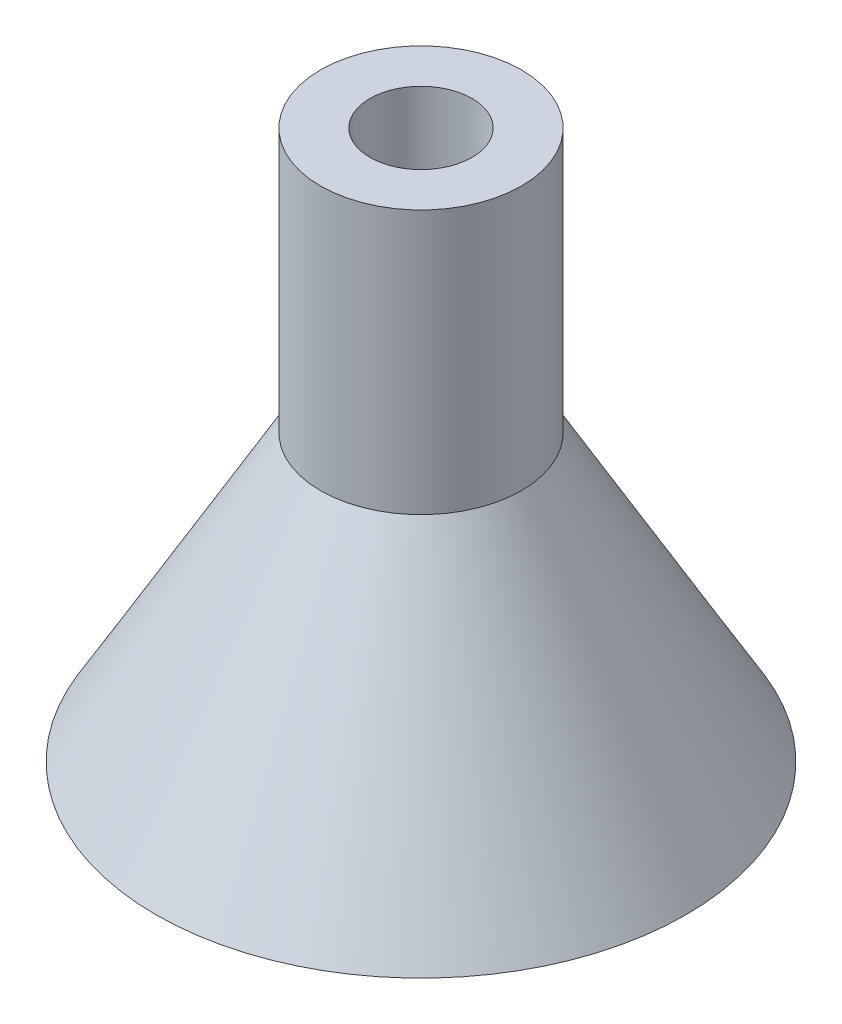
ISO-10303-21;
HEADER;
FILE_DESCRIPTION(('STEP AP214'),'2;1');
FILE_NAME('part.step','',(''),(''),'','','');
FILE_SCHEMA(('AUTOMOTIVE_DESIGN { 1 0 10303 214 1 1 1 1 }'));
ENDSEC;
DATA;
#1=APPLICATION_CONTEXT('core data for automotive mechanical design processes');
#2=APPLICATION_PROTOCOL_DEFINITION('international standard','automotive_design',2000,#1);
#3=PRODUCT_CONTEXT('',#1,'mechanical');
#4=PRODUCT('Part','Part','',(#3));
#5=PRODUCT_RELATED_PRODUCT_CATEGORY('part','',(#4));
#6=PRODUCT_DEFINITION_FORMATION('','',#4);
#7=PRODUCT_DEFINITION_CONTEXT('part definition',#1,'design');
#8=PRODUCT_DEFINITION('design','',#6,#7);
#9=PRODUCT_DEFINITION_SHAPE('','',#8);
#10=(LENGTH_UNIT() NAMED_UNIT(*) SI_UNIT(.MILLI.,.METRE.));
#11=(NAMED_UNIT(*) PLANE_ANGLE_UNIT() SI_UNIT($,.RADIAN.));
#12=(NAMED_UNIT(*) SI_UNIT($,.STERADIAN.) SOLID_ANGLE_UNIT());
#13=UNCERTAINTY_MEASURE_WITH_UNIT(LENGTH_MEASURE(1.E-05),#10,'distance_accuracy_value','');
#14=(GEOMETRIC_REPRESENTATION_CONTEXT(3) GLOBAL_UNCERTAINTY_ASSIGNED_CONTEXT((#13)) GLOBAL_UNIT_ASSIGNED_CONTEXT((#10,
#11,#12)) REPRESENTATION_CONTEXT('',''));
#15=CARTESIAN_POINT('',(0.,0.,0.));
#16=DIRECTION('',(0.,0.,1.));
#17=DIRECTION('',(1.,0.,0.));
#18=AXIS2_PLACEMENT_3D('',#15,#16,#17);
#19=CARTESIAN_POINT('',(0.,0.,0.));
#20=DIRECTION('',(0.,-1.,0.));
#21=DIRECTION('',(0.,0.,-1.));
#22=AXIS2_PLACEMENT_3D('',#19,#20,#21);
#23=CONICAL_SURFACE('',#22,16.0745216452511,0.523598775598293);
#24=CARTESIAN_POINT('',(0.,17.283306474001,0.));
#25=DIRECTION('',(0.,-1.,0.));
#26=DIRECTION('',(0.,0.,-1.));
#27=AXIS2_PLACEMENT_3D('',#24,#25,#26);
#28=CIRCLE('',#27,6.096);
#29=CARTESIAN_POINT('',(0.,17.283306474001,-6.096));
#30=VERTEX_POINT('',#29);
#31=EDGE_CURVE('E10',#30,#30,#28,.T.);
#32=ORIENTED_EDGE('',*,*,#31,.T.);
#33=EDGE_LOOP('',(#32));
#34=FACE_BOUND('',#33,.T.);
#35=CARTESIAN_POINT('',(0.,0.,0.));
#36=DIRECTION('',(0.,-1.,0.));
#37=DIRECTION('',(0.,0.,-1.));
#38=AXIS2_PLACEMENT_3D('',#35,#36,#37);
#39=CIRCLE('',#38,16.0745216452511);
#40=CARTESIAN_POINT('',(0.,0.,-16.0745216452511));
#41=VERTEX_POINT('',#40);
#42=EDGE_CURVE('E53',#41,#41,#39,.T.);
#43=ORIENTED_EDGE('',*,*,#42,.F.);
#44=EDGE_LOOP('',(#43));
#45=FACE_BOUND('',#44,.T.);
#46=ADVANCED_FACE('F31',(#34,#45),#23,.T.);
#47=CARTESIAN_POINT('',(0.,0.,0.));
#48=DIRECTION('',(0.,-1.,0.));
#49=DIRECTION('',(0.,0.,-1.));
#50=AXIS2_PLACEMENT_3D('',#47,#48,#49);
#51=CYLINDRICAL_SURFACE('',#50,6.096);
#52=CARTESIAN_POINT('',(0.,33.283306474001,0.));
#53=DIRECTION('',(0.,-1.,0.));
#54=DIRECTION('',(0.,0.,-1.));
#55=AXIS2_PLACEMENT_3D('',#52,#53,#54);
#56=CIRCLE('',#55,6.096);
#57=CARTESIAN_POINT('',(0.,33.283306474001,-6.096));
#58=VERTEX_POINT('',#57);
#59=EDGE_CURVE('E37',#58,#58,#56,.T.);
#60=ORIENTED_EDGE('',*,*,#59,.T.);
#61=EDGE_LOOP('',(#60));
#62=FACE_BOUND('',#61,.T.);
#63=ORIENTED_EDGE('',*,*,#31,.F.);
#64=EDGE_LOOP('',(#63));
#65=FACE_BOUND('',#64,.T.);
#66=ADVANCED_FACE('F61',(#62,#65),#51,.T.);
#67=CARTESIAN_POINT('',(6.096,33.283306474001,0.));
#68=DIRECTION('',(0.,1.,0.));
#69=DIRECTION('',(0.,0.,1.));
#70=AXIS2_PLACEMENT_3D('',#67,#68,#69);
#71=PLANE('',#70);
#72=CARTESIAN_POINT('',(0.,33.283306474001,0.));
#73=DIRECTION('',(0.,-1.,0.));
#74=DIRECTION('',(0.,0.,-1.));
#75=AXIS2_PLACEMENT_3D('',#72,#73,#74);
#76=CIRCLE('',#75,3.096);
#77=CARTESIAN_POINT('',(0.,33.283306474001,-3.096));
#78=VERTEX_POINT('',#77);
#79=EDGE_CURVE('E41',#78,#78,#76,.T.);
#80=ORIENTED_EDGE('',*,*,#79,.T.);
#81=EDGE_LOOP('',(#80));
#82=FACE_BOUND('',#81,.T.);
#83=ORIENTED_EDGE('',*,*,#59,.F.);
#84=EDGE_LOOP('',(#83));
#85=FACE_BOUND('',#84,.T.);
#86=ADVANCED_FACE('F65',(#82,#85),#71,.T.);
#87=CARTESIAN_POINT('',(0.,0.,0.));
#88=DIRECTION('',(0.,-1.,0.));
#89=DIRECTION('',(0.,0.,-1.));
#90=AXIS2_PLACEMENT_3D('',#87,#88,#89);
#91=CYLINDRICAL_SURFACE('',#90,3.096);
#92=CARTESIAN_POINT('',(0.,17.2794588967076,0.));
#93=DIRECTION('',(0.,-1.,0.));
#94=DIRECTION('',(0.,0.,-1.));
#95=AXIS2_PLACEMENT_3D('',#92,#93,#94);
#96=CIRCLE('',#95,3.096);
#97=CARTESIAN_POINT('',(0.,17.2794588967076,-3.096));
#98=VERTEX_POINT('',#97);
#99=EDGE_CURVE('E45',#98,#98,#96,.T.);
#100=ORIENTED_EDGE('',*,*,#99,.T.);
#101=EDGE_LOOP('',(#100));
#102=FACE_BOUND('',#101,.T.);
#103=ORIENTED_EDGE('',*,*,#79,.F.);
#104=EDGE_LOOP('',(#103));
#105=FACE_BOUND('',#104,.T.);
#106=ADVANCED_FACE('F69',(#102,#105),#91,.F.);
#107=CARTESIAN_POINT('',(0.,17.2794588967076,0.));
#108=DIRECTION('',(0.,-1.,0.));
#109=DIRECTION('',(0.,0.,-1.));
#110=AXIS2_PLACEMENT_3D('',#107,#108,#109);
#111=CONICAL_SURFACE('',#110,3.096,0.523598775598293);
#112=CARTESIAN_POINT('',(0.,0.,0.));
#113=DIRECTION('',(0.,-1.,0.));
#114=DIRECTION('',(0.,0.,-1.));
#115=AXIS2_PLACEMENT_3D('',#112,#113,#114);
#116=CIRCLE('',#115,13.0723002454651);
#117=CARTESIAN_POINT('',(0.,0.,-13.0723002454651));
#118=VERTEX_POINT('',#117);
#119=EDGE_CURVE('E50',#118,#118,#116,.T.);
#120=CARTESIAN_POINT('',(0.,0.,-13.0723002454651));
#121=CARTESIAN_POINT('',(0.,0.179994363507372,-12.9683804512415));
#122=CARTESIAN_POINT('',(0.,0.359988727014744,-12.8644606570179));
#123=CARTESIAN_POINT('',(0.,0.719977454029485,-12.6566210685707));
#124=CARTESIAN_POINT('',(0.,0.899971817536856,-12.5527012743471));
#125=CARTESIAN_POINT('',(0.,1.2599605445516,-12.3448616858999));
#126=CARTESIAN_POINT('',(0.,1.43995490805897,-12.2409418916763));
#127=CARTESIAN_POINT('',(0.,1.79994363507371,-12.0331023032291));
#128=CARTESIAN_POINT('',(0.,1.97993799858108,-11.9291825090055));
#129=CARTESIAN_POINT('',(0.,2.33992672559582,-11.7213429205584));
#130=CARTESIAN_POINT('',(0.,2.5199210891032,-11.6174231263348));
#131=CARTESIAN_POINT('',(0.,2.87990981611794,-11.4095835378876));
#132=CARTESIAN_POINT('',(0.,3.05990417962531,-11.305663743664));
#133=CARTESIAN_POINT('',(0.,3.41989290664005,-11.0978241552168));
#134=CARTESIAN_POINT('',(0.,3.59988727014742,-10.9939043609932));
#135=CARTESIAN_POINT('',(0.,3.95987599716217,-10.786064772546));
#136=CARTESIAN_POINT('',(0.,4.13987036066954,-10.6821449783224));
#137=CARTESIAN_POINT('',(0.,4.49985908768428,-10.4743053898752));
#138=CARTESIAN_POINT('',(0.,4.67985345119165,-10.3703855956516));
#139=CARTESIAN_POINT('',(0.,5.03984217820639,-10.1625460072044));
#140=CARTESIAN_POINT('',(0.,5.21983654171376,-10.0586262129808));
#141=CARTESIAN_POINT('',(0.,5.5798252687285,-9.85078662453366));
#142=CARTESIAN_POINT('',(0.,5.75981963223588,-9.74686683031006));
#143=CARTESIAN_POINT('',(0.,6.11980835925062,-9.53902724186287));
#144=CARTESIAN_POINT('',(0.,6.29980272275799,-9.43510744763928));
#145=CARTESIAN_POINT('',(0.,6.65979144977273,-9.22726785919209));
#146=CARTESIAN_POINT('',(0.,6.8397858132801,-9.12334806496849));
#147=CARTESIAN_POINT('',(0.,7.19977454029484,-8.9155084765213));
#148=CARTESIAN_POINT('',(0.,7.37976890380222,-8.81158868229771));
#149=CARTESIAN_POINT('',(0.,7.73975763081696,-8.60374909385052));
#150=CARTESIAN_POINT('',(0.,7.91975199432433,-8.49982929962692));
#151=CARTESIAN_POINT('',(0.,8.27974072133907,-8.29198971117973));
#152=CARTESIAN_POINT('',(0.,8.45973508484644,-8.18806991695614));
#153=CARTESIAN_POINT('',(0.,8.81972381186119,-7.98023032850895));
#154=CARTESIAN_POINT('',(0.,8.99971817536856,-7.87631053428535));
#155=CARTESIAN_POINT('',(0.,9.3597069023833,-7.66847094583817));
#156=CARTESIAN_POINT('',(0.,9.53970126589067,-7.56455115161457));
#157=CARTESIAN_POINT('',(0.,9.89968999290541,-7.35671156316738));
#158=CARTESIAN_POINT('',(0.,10.0796843564128,-7.25279176894379));
#159=CARTESIAN_POINT('',(0.,10.4396730834275,-7.0449521804966));
#160=CARTESIAN_POINT('',(0.,10.6196674469349,-6.94103238627301));
#161=CARTESIAN_POINT('',(0.,10.9796561739496,-6.73319279782582));
#162=CARTESIAN_POINT('',(0.,11.159650537457,-6.62927300360222));
#163=CARTESIAN_POINT('',(0.,11.5196392644718,-6.42143341515503));
#164=CARTESIAN_POINT('',(0.,11.6996336279791,-6.31751362093144));
#165=CARTESIAN_POINT('',(0.,12.0596223549939,-6.10967403248425));
#166=CARTESIAN_POINT('',(0.,12.2396167185012,-6.00575423826065));
#167=CARTESIAN_POINT('',(0.,12.599605445516,-5.79791464981346));
#168=CARTESIAN_POINT('',(0.,12.7795998090234,-5.69399485558987));
#169=CARTESIAN_POINT('',(0.,13.1395885360381,-5.48615526714268));
#170=CARTESIAN_POINT('',(0.,13.3195828995455,-5.38223547291908));
#171=CARTESIAN_POINT('',(0.,13.6795716265602,-5.1743958844719));
#172=CARTESIAN_POINT('',(0.,13.8595659900676,-5.0704760902483));
#173=CARTESIAN_POINT('',(0.,14.2195547170823,-4.86263650180111));
#174=CARTESIAN_POINT('',(0.,14.3995490805897,-4.75871670757752));
#175=CARTESIAN_POINT('',(0.,14.7595378076044,-4.55087711913033));
#176=CARTESIAN_POINT('',(0.,14.9395321711118,-4.44695732490673));
#177=CARTESIAN_POINT('',(0.,15.2995208981265,-4.23911773645954));
#178=CARTESIAN_POINT('',(0.,15.4795152616339,-4.13519794223595));
#179=CARTESIAN_POINT('',(0.,15.8395039886487,-3.92735835378876));
#180=CARTESIAN_POINT('',(0.,16.019498352156,-3.82343855956516));
#181=CARTESIAN_POINT('',(0.,16.3794870791708,-3.61559897111798));
#182=CARTESIAN_POINT('',(0.,16.5594814426781,-3.51167917689438));
#183=CARTESIAN_POINT('',(0.,16.9194701696929,-3.30383958844719));
#184=CARTESIAN_POINT('',(0.,17.0994645332003,-3.1999197942236));
#185=CARTESIAN_POINT('',(0.,17.2794588967076,-3.096));
#186=B_SPLINE_CURVE_WITH_KNOTS('',3,(#120,#121,#122,#123,#124,#125,#126,#127,#128,#129,#130,
#131,#132,#133,#134,#135,#136,#137,#138,#139,#140,#141,#142,#143,#144,#145,#146,#147,#148,#149,
#150,#151,#152,#153,#154,#155,#156,#157,#158,#159,#160,#161,#162,#163,#164,#165,#166,#167,#168,
#169,#170,#171,#172,#173,#174,#175,#176,#177,#178,#179,#180,#181,#182,#183,#184,#185),
.UNSPECIFIED.,.F.,.F.,(4,2,2,2,2,2,2,2,2,2,2,2,2,2,2,2,2,2,2,2,2,2,2,2,2,2,2,2,2,2,2,2,4),(0.,
0.623518765341576,1.24703753068315,1.87055629602472,2.4940750613663,3.11759382670787,
3.74111259204945,4.36463135739102,4.98815012273259,5.61166888807417,6.23518765341574,
6.85870641875732,7.48222518409889,8.10574394944046,8.72926271478204,9.35278148012362,
9.97630024546519,10.5998190108068,11.2233377761483,11.8468565414899,12.4703753068315,
13.0938940721731,13.7174128375146,14.3409316028562,14.9644503681978,15.5879691335394,
16.2114878988809,16.8350066642225,17.4585254295641,18.0820441949057,18.7055629602472,
19.3290817255888,19.9526004909304),.UNSPECIFIED.);
#187=EDGE_CURVE('BSEAM76',#118,#98,#186,.T.);
#188=ORIENTED_EDGE('',*,*,#119,.T.);
#189=ORIENTED_EDGE('',*,*,#99,.F.);
#190=ORIENTED_EDGE('',*,*,#187,.T.);
#191=ORIENTED_EDGE('',*,*,#187,.F.);
#192=EDGE_LOOP('',(#188,#190,#189,#191));
#193=FACE_BOUND('',#192,.T.);
#194=ADVANCED_FACE('F76',(#193),#111,.F.);
#195=CARTESIAN_POINT('',(13.0723002454651,0.,0.));
#196=DIRECTION('',(0.,-1.,0.));
#197=DIRECTION('',(0.,0.,-1.));
#198=AXIS2_PLACEMENT_3D('',#195,#196,#197);
#199=PLANE('',#198);
#200=ORIENTED_EDGE('',*,*,#42,.T.);
#201=EDGE_LOOP('',(#200));
#202=FACE_BOUND('',#201,.T.);
#203=ORIENTED_EDGE('',*,*,#119,.F.);
#204=EDGE_LOOP('',(#203));
#205=FACE_BOUND('',#204,.T.);
#206=ADVANCED_FACE('F57',(#202,#205),#199,.T.);
#207=CLOSED_SHELL('',(#46,#66,#86,#106,#194,#206));
#208=MANIFOLD_SOLID_BREP('B2',#207);
#209=ADVANCED_BREP_SHAPE_REPRESENTATION('',(#18,#208),#14);
#210=SHAPE_DEFINITION_REPRESENTATION(#9,#209);
ENDSEC;
END-ISO-10303-21;
